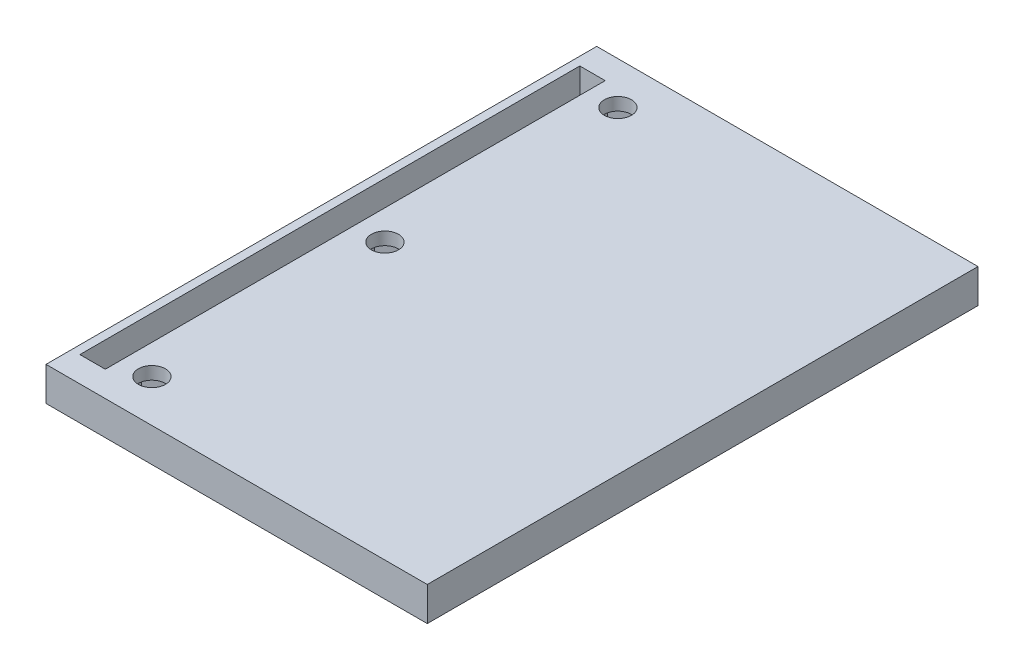
ISO-10303-21;
HEADER;
FILE_DESCRIPTION(('STEP AP214'),'2;1');
FILE_NAME('part.step','',(''),(''),'','','');
FILE_SCHEMA(('AUTOMOTIVE_DESIGN { 1 0 10303 214 1 1 1 1 }'));
ENDSEC;
DATA;
#1=APPLICATION_CONTEXT('core data for automotive mechanical design processes');
#2=APPLICATION_PROTOCOL_DEFINITION('international standard','automotive_design',2000,#1);
#3=PRODUCT_CONTEXT('',#1,'mechanical');
#4=PRODUCT('Part','Part','',(#3));
#5=PRODUCT_RELATED_PRODUCT_CATEGORY('part','',(#4));
#6=PRODUCT_DEFINITION_FORMATION('','',#4);
#7=PRODUCT_DEFINITION_CONTEXT('part definition',#1,'design');
#8=PRODUCT_DEFINITION('design','',#6,#7);
#9=PRODUCT_DEFINITION_SHAPE('','',#8);
#10=(LENGTH_UNIT() NAMED_UNIT(*) SI_UNIT(.MILLI.,.METRE.));
#11=(NAMED_UNIT(*) PLANE_ANGLE_UNIT() SI_UNIT($,.RADIAN.));
#12=(NAMED_UNIT(*) SI_UNIT($,.STERADIAN.) SOLID_ANGLE_UNIT());
#13=UNCERTAINTY_MEASURE_WITH_UNIT(LENGTH_MEASURE(1.E-05),#10,'distance_accuracy_value','');
#14=(GEOMETRIC_REPRESENTATION_CONTEXT(3) GLOBAL_UNCERTAINTY_ASSIGNED_CONTEXT((#13)) GLOBAL_UNIT_ASSIGNED_CONTEXT((#10,
#11,#12)) REPRESENTATION_CONTEXT('',''));
#15=CARTESIAN_POINT('',(0.,0.,0.));
#16=DIRECTION('',(0.,0.,1.));
#17=DIRECTION('',(1.,0.,0.));
#18=AXIS2_PLACEMENT_3D('',#15,#16,#17);
#19=CARTESIAN_POINT('',(-15.,2.,0.));
#20=DIRECTION('',(0.,-1.,0.));
#21=DIRECTION('',(0.,0.,-1.));
#22=AXIS2_PLACEMENT_3D('',#19,#20,#21);
#23=CYLINDRICAL_SURFACE('',#22,1.6);
#24=CARTESIAN_POINT('',(-15.,2.,0.));
#25=DIRECTION('',(0.,1.,0.));
#26=DIRECTION('',(0.,0.,1.));
#27=AXIS2_PLACEMENT_3D('',#24,#25,#26);
#28=CIRCLE('',#27,1.6);
#29=CARTESIAN_POINT('',(-15.,2.,1.60000000000001));
#30=VERTEX_POINT('',#29);
#31=EDGE_CURVE('E390',#30,#30,#28,.T.);
#32=ORIENTED_EDGE('',*,*,#31,.T.);
#33=EDGE_LOOP('',(#32));
#34=FACE_BOUND('',#33,.T.);
#35=CARTESIAN_POINT('',(-15.,0.5,0.));
#36=DIRECTION('',(0.,-1.,0.));
#37=DIRECTION('',(0.,0.,-1.));
#38=AXIS2_PLACEMENT_3D('',#35,#36,#37);
#39=CIRCLE('',#38,1.6);
#40=CARTESIAN_POINT('',(-15.,0.5,-1.59999999999999));
#41=VERTEX_POINT('',#40);
#42=EDGE_CURVE('E423',#41,#41,#39,.T.);
#43=ORIENTED_EDGE('',*,*,#42,.T.);
#44=EDGE_LOOP('',(#43));
#45=FACE_BOUND('',#44,.T.);
#46=ADVANCED_FACE('F32',(#34,#45),#23,.F.);
#47=CARTESIAN_POINT('',(-15.,2.,27.5));
#48=DIRECTION('',(0.,-1.,0.));
#49=DIRECTION('',(0.,0.,-1.));
#50=AXIS2_PLACEMENT_3D('',#47,#48,#49);
#51=CYLINDRICAL_SURFACE('',#50,1.6);
#52=CARTESIAN_POINT('',(-15.,2.,27.5));
#53=DIRECTION('',(0.,1.,0.));
#54=DIRECTION('',(0.,0.,-1.));
#55=AXIS2_PLACEMENT_3D('',#52,#53,#54);
#56=CIRCLE('',#55,1.6);
#57=CARTESIAN_POINT('',(-15.,2.,25.9));
#58=VERTEX_POINT('',#57);
#59=EDGE_CURVE('E387',#58,#58,#56,.T.);
#60=ORIENTED_EDGE('',*,*,#59,.T.);
#61=EDGE_LOOP('',(#60));
#62=FACE_BOUND('',#61,.T.);
#63=CARTESIAN_POINT('',(-15.,0.5,27.5));
#64=DIRECTION('',(0.,-1.,0.));
#65=DIRECTION('',(0.,0.,-1.));
#66=AXIS2_PLACEMENT_3D('',#63,#64,#65);
#67=CIRCLE('',#66,1.6);
#68=CARTESIAN_POINT('',(-15.,0.5,25.9));
#69=VERTEX_POINT('',#68);
#70=EDGE_CURVE('E345',#69,#69,#67,.T.);
#71=ORIENTED_EDGE('',*,*,#70,.T.);
#72=EDGE_LOOP('',(#71));
#73=FACE_BOUND('',#72,.T.);
#74=ADVANCED_FACE('F443',(#62,#73),#51,.F.);
#75=CARTESIAN_POINT('',(0.,2.,0.));
#76=DIRECTION('',(0.,1.,0.));
#77=DIRECTION('',(0.,0.,1.));
#78=AXIS2_PLACEMENT_3D('',#75,#76,#77);
#79=PLANE('',#78);
#80=ORIENTED_EDGE('',*,*,#31,.F.);
#81=EDGE_LOOP('',(#80));
#82=FACE_BOUND('',#81,.T.);
#83=DIRECTION('',(0.,0.,-1.));
#84=VECTOR('',#83,1.);
#85=CARTESIAN_POINT('',(22.5,2.,-32.5));
#86=LINE('',#85,#84);
#87=CARTESIAN_POINT('',(22.5,2.,32.5));
#88=VERTEX_POINT('',#87);
#89=CARTESIAN_POINT('',(22.5,2.,-32.5));
#90=VERTEX_POINT('',#89);
#91=EDGE_CURVE('E397',#88,#90,#86,.T.);
#92=ORIENTED_EDGE('',*,*,#91,.T.);
#93=DIRECTION('',(-1.,0.,0.));
#94=VECTOR('',#93,1.);
#95=CARTESIAN_POINT('',(-22.5,2.,-32.5));
#96=LINE('',#95,#94);
#97=CARTESIAN_POINT('',(-22.5,2.,-32.5));
#98=VERTEX_POINT('',#97);
#99=EDGE_CURVE('E400',#90,#98,#96,.T.);
#100=ORIENTED_EDGE('',*,*,#99,.T.);
#101=DIRECTION('',(0.,0.,1.));
#102=VECTOR('',#101,1.);
#103=CARTESIAN_POINT('',(-22.5,2.,-32.5));
#104=LINE('',#103,#102);
#105=CARTESIAN_POINT('',(-22.5,2.,32.5));
#106=VERTEX_POINT('',#105);
#107=EDGE_CURVE('E403',#98,#106,#104,.T.);
#108=ORIENTED_EDGE('',*,*,#107,.T.);
#109=DIRECTION('',(1.,0.,0.));
#110=VECTOR('',#109,1.);
#111=CARTESIAN_POINT('',(-22.5,2.,32.5));
#112=LINE('',#111,#110);
#113=EDGE_CURVE('E405',#106,#88,#112,.T.);
#114=ORIENTED_EDGE('',*,*,#113,.T.);
#115=EDGE_LOOP('',(#92,#100,#108,#114));
#116=FACE_BOUND('',#115,.T.);
#117=CARTESIAN_POINT('',(-15.,2.,-27.5));
#118=DIRECTION('',(0.,1.,0.));
#119=DIRECTION('',(0.,0.,1.));
#120=AXIS2_PLACEMENT_3D('',#117,#118,#119);
#121=CIRCLE('',#120,1.6);
#122=CARTESIAN_POINT('',(-15.,2.,-25.9));
#123=VERTEX_POINT('',#122);
#124=EDGE_CURVE('E393',#123,#123,#121,.T.);
#125=ORIENTED_EDGE('',*,*,#124,.F.);
#126=EDGE_LOOP('',(#125));
#127=FACE_BOUND('',#126,.T.);
#128=ORIENTED_EDGE('',*,*,#59,.F.);
#129=EDGE_LOOP('',(#128));
#130=FACE_BOUND('',#129,.T.);
#131=DIRECTION('',(-1.,0.,0.));
#132=VECTOR('',#131,1.);
#133=CARTESIAN_POINT('',(-21.5,2.,-29.5));
#134=LINE('',#133,#132);
#135=CARTESIAN_POINT('',(-18.5,2.,-29.5));
#136=VERTEX_POINT('',#135);
#137=CARTESIAN_POINT('',(-21.5,2.,-29.5));
#138=VERTEX_POINT('',#137);
#139=EDGE_CURVE('E358',#136,#138,#134,.T.);
#140=ORIENTED_EDGE('',*,*,#139,.F.);
#141=DIRECTION('',(0.,0.,-1.));
#142=VECTOR('',#141,1.);
#143=CARTESIAN_POINT('',(-18.5,2.,-29.5));
#144=LINE('',#143,#142);
#145=CARTESIAN_POINT('',(-18.5,2.,29.5));
#146=VERTEX_POINT('',#145);
#147=EDGE_CURVE('E356',#146,#136,#144,.T.);
#148=ORIENTED_EDGE('',*,*,#147,.F.);
#149=DIRECTION('',(1.,0.,0.));
#150=VECTOR('',#149,1.);
#151=CARTESIAN_POINT('',(-21.5,2.,29.5));
#152=LINE('',#151,#150);
#153=CARTESIAN_POINT('',(-21.5,2.,29.5));
#154=VERTEX_POINT('',#153);
#155=EDGE_CURVE('E364',#154,#146,#152,.T.);
#156=ORIENTED_EDGE('',*,*,#155,.F.);
#157=DIRECTION('',(0.,0.,1.));
#158=VECTOR('',#157,1.);
#159=CARTESIAN_POINT('',(-21.5,2.,-29.5));
#160=LINE('',#159,#158);
#161=EDGE_CURVE('E361',#138,#154,#160,.T.);
#162=ORIENTED_EDGE('',*,*,#161,.F.);
#163=EDGE_LOOP('',(#140,#148,#156,#162));
#164=FACE_BOUND('',#163,.T.);
#165=ADVANCED_FACE('F439',(#82,#116,#127,#130,#164),#79,.T.);
#166=CARTESIAN_POINT('',(0.,-2.,0.));
#167=DIRECTION('',(0.,1.,0.));
#168=DIRECTION('',(0.,0.,1.));
#169=AXIS2_PLACEMENT_3D('',#166,#167,#168);
#170=PLANE('',#169);
#171=DIRECTION('',(0.866025403784438,0.,0.500000000000001));
#172=VECTOR('',#171,1.);
#173=CARTESIAN_POINT('',(-15.,-2.,24.1802359521597));
#174=LINE('',#173,#172);
#175=CARTESIAN_POINT('',(-15.,-2.,24.1802359521597));
#176=VERTEX_POINT('',#175);
#177=CARTESIAN_POINT('',(-12.125,-2.,25.8401179760799));
#178=VERTEX_POINT('',#177);
#179=EDGE_CURVE('E284',#176,#178,#174,.T.);
#180=ORIENTED_EDGE('',*,*,#179,.F.);
#181=DIRECTION('',(0.866025403784439,0.,-0.5));
#182=VECTOR('',#181,1.);
#183=CARTESIAN_POINT('',(-17.875,-2.,25.8401179760798));
#184=LINE('',#183,#182);
#185=CARTESIAN_POINT('',(-17.875,-2.,25.8401179760798));
#186=VERTEX_POINT('',#185);
#187=EDGE_CURVE('E49',#186,#176,#184,.T.);
#188=ORIENTED_EDGE('',*,*,#187,.F.);
#189=DIRECTION('',(0.,0.,-1.));
#190=VECTOR('',#189,1.);
#191=CARTESIAN_POINT('',(-17.875,-2.,29.1598820239202));
#192=LINE('',#191,#190);
#193=CARTESIAN_POINT('',(-17.875,-2.,29.1598820239202));
#194=VERTEX_POINT('',#193);
#195=EDGE_CURVE('E267',#194,#186,#192,.T.);
#196=ORIENTED_EDGE('',*,*,#195,.F.);
#197=DIRECTION('',(-0.866025403784439,0.,-0.5));
#198=VECTOR('',#197,1.);
#199=CARTESIAN_POINT('',(-15.,-2.,30.8197640478403));
#200=LINE('',#199,#198);
#201=CARTESIAN_POINT('',(-15.,-2.,30.8197640478403));
#202=VERTEX_POINT('',#201);
#203=EDGE_CURVE('E293',#202,#194,#200,.T.);
#204=ORIENTED_EDGE('',*,*,#203,.F.);
#205=DIRECTION('',(-0.866025403784439,0.,0.5));
#206=VECTOR('',#205,1.);
#207=CARTESIAN_POINT('',(-12.125,-2.,29.1598820239202));
#208=LINE('',#207,#206);
#209=CARTESIAN_POINT('',(-12.125,-2.,29.1598820239202));
#210=VERTEX_POINT('',#209);
#211=EDGE_CURVE('E290',#210,#202,#208,.T.);
#212=ORIENTED_EDGE('',*,*,#211,.F.);
#213=DIRECTION('',(0.,0.,1.));
#214=VECTOR('',#213,1.);
#215=CARTESIAN_POINT('',(-12.125,-2.,25.8401179760799));
#216=LINE('',#215,#214);
#217=EDGE_CURVE('E287',#178,#210,#216,.T.);
#218=ORIENTED_EDGE('',*,*,#217,.F.);
#219=EDGE_LOOP('',(#180,#188,#196,#204,#212,#218));
#220=FACE_BOUND('',#219,.T.);
#221=DIRECTION('',(0.866025403784439,0.,-0.5));
#222=VECTOR('',#221,1.);
#223=CARTESIAN_POINT('',(-15.,-2.,-30.8197640478404));
#224=LINE('',#223,#222);
#225=CARTESIAN_POINT('',(-17.875,-2.,-29.1598820239202));
#226=VERTEX_POINT('',#225);
#227=CARTESIAN_POINT('',(-15.,-2.,-30.8197640478404));
#228=VERTEX_POINT('',#227);
#229=EDGE_CURVE('E242',#226,#228,#224,.T.);
#230=ORIENTED_EDGE('',*,*,#229,.F.);
#231=DIRECTION('',(0.,0.,-1.));
#232=VECTOR('',#231,1.);
#233=CARTESIAN_POINT('',(-17.875,-2.,-29.1598820239202));
#234=LINE('',#233,#232);
#235=CARTESIAN_POINT('',(-17.875,-2.,-25.8401179760798));
#236=VERTEX_POINT('',#235);
#237=EDGE_CURVE('E57',#236,#226,#234,.T.);
#238=ORIENTED_EDGE('',*,*,#237,.F.);
#239=DIRECTION('',(-0.866025403784438,0.,-0.5));
#240=VECTOR('',#239,1.);
#241=CARTESIAN_POINT('',(-17.875,-2.,-25.8401179760798));
#242=LINE('',#241,#240);
#243=CARTESIAN_POINT('',(-15.,-2.,-24.1802359521597));
#244=VERTEX_POINT('',#243);
#245=EDGE_CURVE('E228',#244,#236,#242,.T.);
#246=ORIENTED_EDGE('',*,*,#245,.F.);
#247=DIRECTION('',(-0.866025403784439,0.,0.499999999999999));
#248=VECTOR('',#247,1.);
#249=CARTESIAN_POINT('',(-15.,-2.,-24.1802359521597));
#250=LINE('',#249,#248);
#251=CARTESIAN_POINT('',(-12.125,-2.,-25.8401179760799));
#252=VERTEX_POINT('',#251);
#253=EDGE_CURVE('E231',#252,#244,#250,.T.);
#254=ORIENTED_EDGE('',*,*,#253,.F.);
#255=DIRECTION('',(0.,0.,1.));
#256=VECTOR('',#255,1.);
#257=CARTESIAN_POINT('',(-12.125,-2.,-25.8401179760799));
#258=LINE('',#257,#256);
#259=CARTESIAN_POINT('',(-12.125,-2.,-29.1598820239202));
#260=VERTEX_POINT('',#259);
#261=EDGE_CURVE('E248',#260,#252,#258,.T.);
#262=ORIENTED_EDGE('',*,*,#261,.F.);
#263=DIRECTION('',(0.866025403784438,0.,0.500000000000001));
#264=VECTOR('',#263,1.);
#265=CARTESIAN_POINT('',(-12.125,-2.,-29.1598820239202));
#266=LINE('',#265,#264);
#267=EDGE_CURVE('E245',#228,#260,#266,.T.);
#268=ORIENTED_EDGE('',*,*,#267,.F.);
#269=EDGE_LOOP('',(#230,#238,#246,#254,#262,#268));
#270=FACE_BOUND('',#269,.T.);
#271=DIRECTION('',(0.866025403784439,0.,0.5));
#272=VECTOR('',#271,1.);
#273=CARTESIAN_POINT('',(-15.,-2.,-3.31976404784034));
#274=LINE('',#273,#272);
#275=CARTESIAN_POINT('',(-15.,-2.,-3.31976404784034));
#276=VERTEX_POINT('',#275);
#277=CARTESIAN_POINT('',(-12.125,-2.,-1.65988202392016));
#278=VERTEX_POINT('',#277);
#279=EDGE_CURVE('E329',#276,#278,#274,.T.);
#280=ORIENTED_EDGE('',*,*,#279,.F.);
#281=DIRECTION('',(0.866025403784438,0.,-0.5));
#282=VECTOR('',#281,1.);
#283=CARTESIAN_POINT('',(-17.875,-2.,-1.65988202392017));
#284=LINE('',#283,#282);
#285=CARTESIAN_POINT('',(-17.875,-2.,-1.65988202392017));
#286=VERTEX_POINT('',#285);
#287=EDGE_CURVE('E255',#286,#276,#284,.T.);
#288=ORIENTED_EDGE('',*,*,#287,.F.);
#289=DIRECTION('',(0.,0.,-1.));
#290=VECTOR('',#289,1.);
#291=CARTESIAN_POINT('',(-17.875,-2.,1.65988202392018));
#292=LINE('',#291,#290);
#293=CARTESIAN_POINT('',(-17.875,-2.,1.65988202392018));
#294=VERTEX_POINT('',#293);
#295=EDGE_CURVE('E312',#294,#286,#292,.T.);
#296=ORIENTED_EDGE('',*,*,#295,.F.);
#297=DIRECTION('',(-0.866025403784439,0.,-0.5));
#298=VECTOR('',#297,1.);
#299=CARTESIAN_POINT('',(-15.,-2.,3.31976404784036));
#300=LINE('',#299,#298);
#301=CARTESIAN_POINT('',(-15.,-2.,3.31976404784036));
#302=VERTEX_POINT('',#301);
#303=EDGE_CURVE('E338',#302,#294,#300,.T.);
#304=ORIENTED_EDGE('',*,*,#303,.F.);
#305=DIRECTION('',(-0.866025403784439,0.,0.5));
#306=VECTOR('',#305,1.);
#307=CARTESIAN_POINT('',(-12.125,-2.,1.65988202392018));
#308=LINE('',#307,#306);
#309=CARTESIAN_POINT('',(-12.125,-2.,1.65988202392018));
#310=VERTEX_POINT('',#309);
#311=EDGE_CURVE('E335',#310,#302,#308,.T.);
#312=ORIENTED_EDGE('',*,*,#311,.F.);
#313=DIRECTION('',(0.,0.,1.));
#314=VECTOR('',#313,1.);
#315=CARTESIAN_POINT('',(-12.125,-2.,-1.65988202392016));
#316=LINE('',#315,#314);
#317=EDGE_CURVE('E332',#278,#310,#316,.T.);
#318=ORIENTED_EDGE('',*,*,#317,.F.);
#319=EDGE_LOOP('',(#280,#288,#296,#304,#312,#318));
#320=FACE_BOUND('',#319,.T.);
#321=DIRECTION('',(0.,0.,-1.));
#322=VECTOR('',#321,1.);
#323=CARTESIAN_POINT('',(22.5,-2.,-32.5));
#324=LINE('',#323,#322);
#325=CARTESIAN_POINT('',(22.5,-2.,32.5));
#326=VERTEX_POINT('',#325);
#327=CARTESIAN_POINT('',(22.5,-2.,-32.5));
#328=VERTEX_POINT('',#327);
#329=EDGE_CURVE('E396',#326,#328,#324,.T.);
#330=ORIENTED_EDGE('',*,*,#329,.F.);
#331=DIRECTION('',(1.,0.,0.));
#332=VECTOR('',#331,1.);
#333=CARTESIAN_POINT('',(-22.5,-2.,32.5));
#334=LINE('',#333,#332);
#335=CARTESIAN_POINT('',(-22.5,-2.,32.5));
#336=VERTEX_POINT('',#335);
#337=EDGE_CURVE('E401',#336,#326,#334,.T.);
#338=ORIENTED_EDGE('',*,*,#337,.F.);
#339=DIRECTION('',(0.,0.,1.));
#340=VECTOR('',#339,1.);
#341=CARTESIAN_POINT('',(-22.5,-2.,-32.5));
#342=LINE('',#341,#340);
#343=CARTESIAN_POINT('',(-22.5,-2.,-32.5));
#344=VERTEX_POINT('',#343);
#345=EDGE_CURVE('E412',#344,#336,#342,.T.);
#346=ORIENTED_EDGE('',*,*,#345,.F.);
#347=DIRECTION('',(-1.,0.,0.));
#348=VECTOR('',#347,1.);
#349=CARTESIAN_POINT('',(-22.5,-2.,-32.5));
#350=LINE('',#349,#348);
#351=EDGE_CURVE('E410',#328,#344,#350,.T.);
#352=ORIENTED_EDGE('',*,*,#351,.F.);
#353=EDGE_LOOP('',(#330,#338,#346,#352));
#354=FACE_BOUND('',#353,.T.);
#355=DIRECTION('',(0.,0.,-1.));
#356=VECTOR('',#355,1.);
#357=CARTESIAN_POINT('',(-18.5,-2.,-29.5));
#358=LINE('',#357,#356);
#359=CARTESIAN_POINT('',(-18.5,-2.,29.5));
#360=VERTEX_POINT('',#359);
#361=CARTESIAN_POINT('',(-18.5,-2.,-29.5));
#362=VERTEX_POINT('',#361);
#363=EDGE_CURVE('E367',#360,#362,#358,.T.);
#364=ORIENTED_EDGE('',*,*,#363,.T.);
#365=DIRECTION('',(-1.,0.,0.));
#366=VECTOR('',#365,1.);
#367=CARTESIAN_POINT('',(-21.5,-2.,-29.5));
#368=LINE('',#367,#366);
#369=CARTESIAN_POINT('',(-21.5,-2.,-29.5));
#370=VERTEX_POINT('',#369);
#371=EDGE_CURVE('E370',#362,#370,#368,.T.);
#372=ORIENTED_EDGE('',*,*,#371,.T.);
#373=DIRECTION('',(0.,0.,1.));
#374=VECTOR('',#373,1.);
#375=CARTESIAN_POINT('',(-21.5,-2.,-29.5));
#376=LINE('',#375,#374);
#377=CARTESIAN_POINT('',(-21.5,-2.,29.5));
#378=VERTEX_POINT('',#377);
#379=EDGE_CURVE('E373',#370,#378,#376,.T.);
#380=ORIENTED_EDGE('',*,*,#379,.T.);
#381=DIRECTION('',(1.,0.,0.));
#382=VECTOR('',#381,1.);
#383=CARTESIAN_POINT('',(-21.5,-2.,29.5));
#384=LINE('',#383,#382);
#385=EDGE_CURVE('E359',#378,#360,#384,.T.);
#386=ORIENTED_EDGE('',*,*,#385,.T.);
#387=EDGE_LOOP('',(#364,#372,#380,#386));
#388=FACE_BOUND('',#387,.T.);
#389=ADVANCED_FACE('F442',(#220,#270,#320,#354,#388),#170,.F.);
#390=CARTESIAN_POINT('',(22.5,2.,-32.5));
#391=DIRECTION('',(-1.,0.,0.));
#392=DIRECTION('',(0.,0.,1.));
#393=AXIS2_PLACEMENT_3D('',#390,#391,#392);
#394=PLANE('',#393);
#395=ORIENTED_EDGE('',*,*,#329,.T.);
#396=DIRECTION('',(0.,-1.,0.));
#397=VECTOR('',#396,1.);
#398=CARTESIAN_POINT('',(22.5,2.,-32.5));
#399=LINE('',#398,#397);
#400=EDGE_CURVE('E11',#90,#328,#399,.T.);
#401=ORIENTED_EDGE('',*,*,#400,.F.);
#402=ORIENTED_EDGE('',*,*,#91,.F.);
#403=DIRECTION('',(0.,-1.,0.));
#404=VECTOR('',#403,1.);
#405=CARTESIAN_POINT('',(22.5,2.,32.5));
#406=LINE('',#405,#404);
#407=EDGE_CURVE('E407',#88,#326,#406,.T.);
#408=ORIENTED_EDGE('',*,*,#407,.T.);
#409=EDGE_LOOP('',(#395,#401,#402,#408));
#410=FACE_BOUND('',#409,.T.);
#411=ADVANCED_FACE('F34',(#410),#394,.F.);
#412=CARTESIAN_POINT('',(-22.5,2.,-32.5));
#413=DIRECTION('',(0.,0.,1.));
#414=DIRECTION('',(1.,0.,0.));
#415=AXIS2_PLACEMENT_3D('',#412,#413,#414);
#416=PLANE('',#415);
#417=ORIENTED_EDGE('',*,*,#351,.T.);
#418=DIRECTION('',(0.,-1.,0.));
#419=VECTOR('',#418,1.);
#420=CARTESIAN_POINT('',(-22.5,2.,-32.5));
#421=LINE('',#420,#419);
#422=EDGE_CURVE('E41',#98,#344,#421,.T.);
#423=ORIENTED_EDGE('',*,*,#422,.F.);
#424=ORIENTED_EDGE('',*,*,#99,.F.);
#425=ORIENTED_EDGE('',*,*,#400,.T.);
#426=EDGE_LOOP('',(#417,#423,#424,#425));
#427=FACE_BOUND('',#426,.T.);
#428=ADVANCED_FACE('F494',(#427),#416,.F.);
#429=CARTESIAN_POINT('',(-22.5,2.,-32.5));
#430=DIRECTION('',(1.,0.,0.));
#431=DIRECTION('',(0.,0.,-1.));
#432=AXIS2_PLACEMENT_3D('',#429,#430,#431);
#433=PLANE('',#432);
#434=ORIENTED_EDGE('',*,*,#345,.T.);
#435=DIRECTION('',(0.,-1.,0.));
#436=VECTOR('',#435,1.);
#437=CARTESIAN_POINT('',(-22.5,2.,32.5));
#438=LINE('',#437,#436);
#439=EDGE_CURVE('E417',#106,#336,#438,.T.);
#440=ORIENTED_EDGE('',*,*,#439,.F.);
#441=ORIENTED_EDGE('',*,*,#107,.F.);
#442=ORIENTED_EDGE('',*,*,#422,.T.);
#443=EDGE_LOOP('',(#434,#440,#441,#442));
#444=FACE_BOUND('',#443,.T.);
#445=ADVANCED_FACE('F491',(#444),#433,.F.);
#446=CARTESIAN_POINT('',(-22.5,2.,32.5));
#447=DIRECTION('',(0.,0.,-1.));
#448=DIRECTION('',(-1.,0.,0.));
#449=AXIS2_PLACEMENT_3D('',#446,#447,#448);
#450=PLANE('',#449);
#451=ORIENTED_EDGE('',*,*,#337,.T.);
#452=ORIENTED_EDGE('',*,*,#407,.F.);
#453=ORIENTED_EDGE('',*,*,#113,.F.);
#454=ORIENTED_EDGE('',*,*,#439,.T.);
#455=EDGE_LOOP('',(#451,#452,#453,#454));
#456=FACE_BOUND('',#455,.T.);
#457=ADVANCED_FACE('F435',(#456),#450,.F.);
#458=CARTESIAN_POINT('',(-15.,2.,-27.5));
#459=DIRECTION('',(0.,-1.,0.));
#460=DIRECTION('',(0.,0.,-1.));
#461=AXIS2_PLACEMENT_3D('',#458,#459,#460);
#462=CYLINDRICAL_SURFACE('',#461,1.6);
#463=CARTESIAN_POINT('',(-15.,0.5,-27.5));
#464=DIRECTION('',(0.,1.,0.));
#465=DIRECTION('',(0.,0.,1.));
#466=AXIS2_PLACEMENT_3D('',#463,#464,#465);
#467=CIRCLE('',#466,1.6);
#468=CARTESIAN_POINT('',(-15.,0.5,-25.9));
#469=VERTEX_POINT('',#468);
#470=EDGE_CURVE('E36',#469,#469,#467,.T.);
#471=ORIENTED_EDGE('',*,*,#470,.F.);
#472=EDGE_LOOP('',(#471));
#473=FACE_BOUND('',#472,.T.);
#474=ORIENTED_EDGE('',*,*,#124,.T.);
#475=EDGE_LOOP('',(#474));
#476=FACE_BOUND('',#475,.T.);
#477=ADVANCED_FACE('F431',(#473,#476),#462,.F.);
#478=CARTESIAN_POINT('',(-18.5,2.,-29.5));
#479=DIRECTION('',(-1.,0.,0.));
#480=DIRECTION('',(0.,0.,1.));
#481=AXIS2_PLACEMENT_3D('',#478,#479,#480);
#482=PLANE('',#481);
#483=ORIENTED_EDGE('',*,*,#363,.F.);
#484=DIRECTION('',(0.,-1.,0.));
#485=VECTOR('',#484,1.);
#486=CARTESIAN_POINT('',(-18.5,2.,29.5));
#487=LINE('',#486,#485);
#488=EDGE_CURVE('E366',#146,#360,#487,.T.);
#489=ORIENTED_EDGE('',*,*,#488,.F.);
#490=ORIENTED_EDGE('',*,*,#147,.T.);
#491=DIRECTION('',(0.,-1.,0.));
#492=VECTOR('',#491,1.);
#493=CARTESIAN_POINT('',(-18.5,2.,-29.5));
#494=LINE('',#493,#492);
#495=EDGE_CURVE('E384',#136,#362,#494,.T.);
#496=ORIENTED_EDGE('',*,*,#495,.T.);
#497=EDGE_LOOP('',(#483,#489,#490,#496));
#498=FACE_BOUND('',#497,.T.);
#499=ADVANCED_FACE('F434',(#498),#482,.T.);
#500=CARTESIAN_POINT('',(-21.5,2.,-29.5));
#501=DIRECTION('',(0.,0.,1.));
#502=DIRECTION('',(1.,0.,0.));
#503=AXIS2_PLACEMENT_3D('',#500,#501,#502);
#504=PLANE('',#503);
#505=ORIENTED_EDGE('',*,*,#371,.F.);
#506=ORIENTED_EDGE('',*,*,#495,.F.);
#507=ORIENTED_EDGE('',*,*,#139,.T.);
#508=DIRECTION('',(0.,-1.,0.));
#509=VECTOR('',#508,1.);
#510=CARTESIAN_POINT('',(-21.5,2.,-29.5));
#511=LINE('',#510,#509);
#512=EDGE_CURVE('E382',#138,#370,#511,.T.);
#513=ORIENTED_EDGE('',*,*,#512,.T.);
#514=EDGE_LOOP('',(#505,#506,#507,#513));
#515=FACE_BOUND('',#514,.T.);
#516=ADVANCED_FACE('F455',(#515),#504,.T.);
#517=CARTESIAN_POINT('',(-21.5,2.,-29.5));
#518=DIRECTION('',(1.,0.,0.));
#519=DIRECTION('',(0.,0.,-1.));
#520=AXIS2_PLACEMENT_3D('',#517,#518,#519);
#521=PLANE('',#520);
#522=ORIENTED_EDGE('',*,*,#379,.F.);
#523=ORIENTED_EDGE('',*,*,#512,.F.);
#524=ORIENTED_EDGE('',*,*,#161,.T.);
#525=DIRECTION('',(0.,-1.,0.));
#526=VECTOR('',#525,1.);
#527=CARTESIAN_POINT('',(-21.5,2.,29.5));
#528=LINE('',#527,#526);
#529=EDGE_CURVE('E380',#154,#378,#528,.T.);
#530=ORIENTED_EDGE('',*,*,#529,.T.);
#531=EDGE_LOOP('',(#522,#523,#524,#530));
#532=FACE_BOUND('',#531,.T.);
#533=ADVANCED_FACE('F458',(#532),#521,.T.);
#534=CARTESIAN_POINT('',(-21.5,2.,29.5));
#535=DIRECTION('',(0.,0.,-1.));
#536=DIRECTION('',(-1.,0.,0.));
#537=AXIS2_PLACEMENT_3D('',#534,#535,#536);
#538=PLANE('',#537);
#539=ORIENTED_EDGE('',*,*,#385,.F.);
#540=ORIENTED_EDGE('',*,*,#529,.F.);
#541=ORIENTED_EDGE('',*,*,#155,.T.);
#542=ORIENTED_EDGE('',*,*,#488,.T.);
#543=EDGE_LOOP('',(#539,#540,#541,#542));
#544=FACE_BOUND('',#543,.T.);
#545=ADVANCED_FACE('F464',(#544),#538,.T.);
#546=CARTESIAN_POINT('',(-17.875,0.5,25.8401179760798));
#547=DIRECTION('',(-0.5,0.,-0.866025403784439));
#548=DIRECTION('',(-0.866025403784439,0.,0.5));
#549=AXIS2_PLACEMENT_3D('',#546,#547,#548);
#550=PLANE('',#549);
#551=ORIENTED_EDGE('',*,*,#187,.T.);
#552=DIRECTION('',(0.,-1.,0.));
#553=VECTOR('',#552,1.);
#554=CARTESIAN_POINT('',(-15.,0.5,24.1802359521597));
#555=LINE('',#554,#553);
#556=CARTESIAN_POINT('',(-15.,0.5,24.1802359521597));
#557=VERTEX_POINT('',#556);
#558=EDGE_CURVE('E282',#557,#176,#555,.T.);
#559=ORIENTED_EDGE('',*,*,#558,.F.);
#560=DIRECTION('',(0.866025403784439,0.,-0.5));
#561=VECTOR('',#560,1.);
#562=CARTESIAN_POINT('',(-17.875,0.5,25.8401179760798));
#563=LINE('',#562,#561);
#564=CARTESIAN_POINT('',(-17.875,0.5,25.8401179760798));
#565=VERTEX_POINT('',#564);
#566=EDGE_CURVE('E263',#565,#557,#563,.T.);
#567=ORIENTED_EDGE('',*,*,#566,.F.);
#568=DIRECTION('',(0.,-1.,0.));
#569=VECTOR('',#568,1.);
#570=CARTESIAN_POINT('',(-17.875,0.5,25.8401179760798));
#571=LINE('',#570,#569);
#572=EDGE_CURVE('E243',#565,#186,#571,.T.);
#573=ORIENTED_EDGE('',*,*,#572,.T.);
#574=EDGE_LOOP('',(#551,#559,#567,#573));
#575=FACE_BOUND('',#574,.T.);
#576=ADVANCED_FACE('F466',(#575),#550,.F.);
#577=CARTESIAN_POINT('',(-17.875,0.5,29.1598820239202));
#578=DIRECTION('',(-1.,0.,0.));
#579=DIRECTION('',(0.,0.,1.));
#580=AXIS2_PLACEMENT_3D('',#577,#578,#579);
#581=PLANE('',#580);
#582=ORIENTED_EDGE('',*,*,#195,.T.);
#583=ORIENTED_EDGE('',*,*,#572,.F.);
#584=DIRECTION('',(0.,0.,-1.));
#585=VECTOR('',#584,1.);
#586=CARTESIAN_POINT('',(-17.875,0.5,29.1598820239202));
#587=LINE('',#586,#585);
#588=CARTESIAN_POINT('',(-17.875,0.5,29.1598820239202));
#589=VERTEX_POINT('',#588);
#590=EDGE_CURVE('E279',#589,#565,#587,.T.);
#591=ORIENTED_EDGE('',*,*,#590,.F.);
#592=DIRECTION('',(0.,-1.,0.));
#593=VECTOR('',#592,1.);
#594=CARTESIAN_POINT('',(-17.875,0.5,29.1598820239202));
#595=LINE('',#594,#593);
#596=EDGE_CURVE('E299',#589,#194,#595,.T.);
#597=ORIENTED_EDGE('',*,*,#596,.T.);
#598=EDGE_LOOP('',(#582,#583,#591,#597));
#599=FACE_BOUND('',#598,.T.);
#600=ADVANCED_FACE('F472',(#599),#581,.F.);
#601=CARTESIAN_POINT('',(-15.,0.5,30.8197640478403));
#602=DIRECTION('',(-0.5,0.,0.866025403784439));
#603=DIRECTION('',(0.866025403784439,0.,0.5));
#604=AXIS2_PLACEMENT_3D('',#601,#602,#603);
#605=PLANE('',#604);
#606=ORIENTED_EDGE('',*,*,#203,.T.);
#607=ORIENTED_EDGE('',*,*,#596,.F.);
#608=DIRECTION('',(-0.866025403784439,0.,-0.5));
#609=VECTOR('',#608,1.);
#610=CARTESIAN_POINT('',(-15.,0.5,30.8197640478403));
#611=LINE('',#610,#609);
#612=CARTESIAN_POINT('',(-15.,0.5,30.8197640478403));
#613=VERTEX_POINT('',#612);
#614=EDGE_CURVE('E276',#613,#589,#611,.T.);
#615=ORIENTED_EDGE('',*,*,#614,.F.);
#616=DIRECTION('',(0.,-1.,0.));
#617=VECTOR('',#616,1.);
#618=CARTESIAN_POINT('',(-15.,0.5,30.8197640478403));
#619=LINE('',#618,#617);
#620=EDGE_CURVE('E301',#613,#202,#619,.T.);
#621=ORIENTED_EDGE('',*,*,#620,.T.);
#622=EDGE_LOOP('',(#606,#607,#615,#621));
#623=FACE_BOUND('',#622,.T.);
#624=ADVANCED_FACE('F600',(#623),#605,.F.);
#625=CARTESIAN_POINT('',(-12.125,0.5,29.1598820239202));
#626=DIRECTION('',(0.5,0.,0.866025403784439));
#627=DIRECTION('',(0.866025403784439,0.,-0.5));
#628=AXIS2_PLACEMENT_3D('',#625,#626,#627);
#629=PLANE('',#628);
#630=ORIENTED_EDGE('',*,*,#211,.T.);
#631=ORIENTED_EDGE('',*,*,#620,.F.);
#632=DIRECTION('',(-0.866025403784439,0.,0.5));
#633=VECTOR('',#632,1.);
#634=CARTESIAN_POINT('',(-12.125,0.5,29.1598820239202));
#635=LINE('',#634,#633);
#636=CARTESIAN_POINT('',(-12.125,0.5,29.1598820239202));
#637=VERTEX_POINT('',#636);
#638=EDGE_CURVE('E273',#637,#613,#635,.T.);
#639=ORIENTED_EDGE('',*,*,#638,.F.);
#640=DIRECTION('',(0.,-1.,0.));
#641=VECTOR('',#640,1.);
#642=CARTESIAN_POINT('',(-12.125,0.5,29.1598820239202));
#643=LINE('',#642,#641);
#644=EDGE_CURVE('E303',#637,#210,#643,.T.);
#645=ORIENTED_EDGE('',*,*,#644,.T.);
#646=EDGE_LOOP('',(#630,#631,#639,#645));
#647=FACE_BOUND('',#646,.T.);
#648=ADVANCED_FACE('F610',(#647),#629,.F.);
#649=CARTESIAN_POINT('',(-12.125,0.5,25.8401179760799));
#650=DIRECTION('',(1.,0.,0.));
#651=DIRECTION('',(0.,0.,-1.));
#652=AXIS2_PLACEMENT_3D('',#649,#650,#651);
#653=PLANE('',#652);
#654=ORIENTED_EDGE('',*,*,#217,.T.);
#655=ORIENTED_EDGE('',*,*,#644,.F.);
#656=DIRECTION('',(0.,0.,1.));
#657=VECTOR('',#656,1.);
#658=CARTESIAN_POINT('',(-12.125,0.5,25.8401179760799));
#659=LINE('',#658,#657);
#660=CARTESIAN_POINT('',(-12.125,0.5,25.8401179760799));
#661=VERTEX_POINT('',#660);
#662=EDGE_CURVE('E270',#661,#637,#659,.T.);
#663=ORIENTED_EDGE('',*,*,#662,.F.);
#664=DIRECTION('',(0.,-1.,0.));
#665=VECTOR('',#664,1.);
#666=CARTESIAN_POINT('',(-12.125,0.5,25.8401179760799));
#667=LINE('',#666,#665);
#668=EDGE_CURVE('E305',#661,#178,#667,.T.);
#669=ORIENTED_EDGE('',*,*,#668,.T.);
#670=EDGE_LOOP('',(#654,#655,#663,#669));
#671=FACE_BOUND('',#670,.T.);
#672=ADVANCED_FACE('F620',(#671),#653,.F.);
#673=CARTESIAN_POINT('',(-15.,0.5,24.1802359521597));
#674=DIRECTION('',(0.500000000000001,0.,-0.866025403784438));
#675=DIRECTION('',(-0.866025403784438,0.,-0.500000000000001));
#676=AXIS2_PLACEMENT_3D('',#673,#674,#675);
#677=PLANE('',#676);
#678=ORIENTED_EDGE('',*,*,#179,.T.);
#679=ORIENTED_EDGE('',*,*,#668,.F.);
#680=DIRECTION('',(0.866025403784438,0.,0.500000000000001));
#681=VECTOR('',#680,1.);
#682=CARTESIAN_POINT('',(-15.,0.5,24.1802359521597));
#683=LINE('',#682,#681);
#684=EDGE_CURVE('E266',#557,#661,#683,.T.);
#685=ORIENTED_EDGE('',*,*,#684,.F.);
#686=ORIENTED_EDGE('',*,*,#558,.T.);
#687=EDGE_LOOP('',(#678,#679,#685,#686));
#688=FACE_BOUND('',#687,.T.);
#689=ADVANCED_FACE('F630',(#688),#677,.F.);
#690=CARTESIAN_POINT('',(0.,0.5,0.));
#691=DIRECTION('',(0.,-1.,0.));
#692=DIRECTION('',(0.,0.,-1.));
#693=AXIS2_PLACEMENT_3D('',#690,#691,#692);
#694=PLANE('',#693);
#695=ORIENTED_EDGE('',*,*,#70,.F.);
#696=EDGE_LOOP('',(#695));
#697=FACE_BOUND('',#696,.T.);
#698=ORIENTED_EDGE('',*,*,#566,.T.);
#699=ORIENTED_EDGE('',*,*,#684,.T.);
#700=ORIENTED_EDGE('',*,*,#662,.T.);
#701=ORIENTED_EDGE('',*,*,#638,.T.);
#702=ORIENTED_EDGE('',*,*,#614,.T.);
#703=ORIENTED_EDGE('',*,*,#590,.T.);
#704=EDGE_LOOP('',(#698,#699,#700,#701,#702,#703));
#705=FACE_BOUND('',#704,.T.);
#706=ADVANCED_FACE('F640',(#697,#705),#694,.T.);
#707=CARTESIAN_POINT('',(-17.875,0.5,-1.65988202392017));
#708=DIRECTION('',(-0.5,0.,-0.866025403784438));
#709=DIRECTION('',(-0.866025403784439,0.,0.5));
#710=AXIS2_PLACEMENT_3D('',#707,#708,#709);
#711=PLANE('',#710);
#712=ORIENTED_EDGE('',*,*,#287,.T.);
#713=DIRECTION('',(0.,-1.,0.));
#714=VECTOR('',#713,1.);
#715=CARTESIAN_POINT('',(-15.,0.5,-3.31976404784034));
#716=LINE('',#715,#714);
#717=CARTESIAN_POINT('',(-15.,0.5,-3.31976404784034));
#718=VERTEX_POINT('',#717);
#719=EDGE_CURVE('E327',#718,#276,#716,.T.);
#720=ORIENTED_EDGE('',*,*,#719,.F.);
#721=DIRECTION('',(0.866025403784438,0.,-0.5));
#722=VECTOR('',#721,1.);
#723=CARTESIAN_POINT('',(-17.875,0.5,-1.65988202392017));
#724=LINE('',#723,#722);
#725=CARTESIAN_POINT('',(-17.875,0.5,-1.65988202392017));
#726=VERTEX_POINT('',#725);
#727=EDGE_CURVE('E308',#726,#718,#724,.T.);
#728=ORIENTED_EDGE('',*,*,#727,.F.);
#729=DIRECTION('',(0.,-1.,0.));
#730=VECTOR('',#729,1.);
#731=CARTESIAN_POINT('',(-17.875,0.5,-1.65988202392017));
#732=LINE('',#731,#730);
#733=EDGE_CURVE('E343',#726,#286,#732,.T.);
#734=ORIENTED_EDGE('',*,*,#733,.T.);
#735=EDGE_LOOP('',(#712,#720,#728,#734));
#736=FACE_BOUND('',#735,.T.);
#737=ADVANCED_FACE('F650',(#736),#711,.F.);
#738=CARTESIAN_POINT('',(-17.875,0.5,1.65988202392018));
#739=DIRECTION('',(-1.,0.,0.));
#740=DIRECTION('',(0.,0.,1.));
#741=AXIS2_PLACEMENT_3D('',#738,#739,#740);
#742=PLANE('',#741);
#743=ORIENTED_EDGE('',*,*,#295,.T.);
#744=ORIENTED_EDGE('',*,*,#733,.F.);
#745=DIRECTION('',(0.,0.,-1.));
#746=VECTOR('',#745,1.);
#747=CARTESIAN_POINT('',(-17.875,0.5,1.65988202392018));
#748=LINE('',#747,#746);
#749=CARTESIAN_POINT('',(-17.875,0.5,1.65988202392018));
#750=VERTEX_POINT('',#749);
#751=EDGE_CURVE('E324',#750,#726,#748,.T.);
#752=ORIENTED_EDGE('',*,*,#751,.F.);
#753=DIRECTION('',(0.,-1.,0.));
#754=VECTOR('',#753,1.);
#755=CARTESIAN_POINT('',(-17.875,0.5,1.65988202392018));
#756=LINE('',#755,#754);
#757=EDGE_CURVE('E346',#750,#294,#756,.T.);
#758=ORIENTED_EDGE('',*,*,#757,.T.);
#759=EDGE_LOOP('',(#743,#744,#752,#758));
#760=FACE_BOUND('',#759,.T.);
#761=ADVANCED_FACE('F660',(#760),#742,.F.);
#762=CARTESIAN_POINT('',(-15.,0.5,3.31976404784036));
#763=DIRECTION('',(-0.5,0.,0.866025403784439));
#764=DIRECTION('',(0.866025403784439,0.,0.5));
#765=AXIS2_PLACEMENT_3D('',#762,#763,#764);
#766=PLANE('',#765);
#767=ORIENTED_EDGE('',*,*,#303,.T.);
#768=ORIENTED_EDGE('',*,*,#757,.F.);
#769=DIRECTION('',(-0.866025403784439,0.,-0.5));
#770=VECTOR('',#769,1.);
#771=CARTESIAN_POINT('',(-15.,0.5,3.31976404784036));
#772=LINE('',#771,#770);
#773=CARTESIAN_POINT('',(-15.,0.5,3.31976404784036));
#774=VERTEX_POINT('',#773);
#775=EDGE_CURVE('E321',#774,#750,#772,.T.);
#776=ORIENTED_EDGE('',*,*,#775,.F.);
#777=DIRECTION('',(0.,-1.,0.));
#778=VECTOR('',#777,1.);
#779=CARTESIAN_POINT('',(-15.,0.5,3.31976404784036));
#780=LINE('',#779,#778);
#781=EDGE_CURVE('E348',#774,#302,#780,.T.);
#782=ORIENTED_EDGE('',*,*,#781,.T.);
#783=EDGE_LOOP('',(#767,#768,#776,#782));
#784=FACE_BOUND('',#783,.T.);
#785=ADVANCED_FACE('F669',(#784),#766,.F.);
#786=CARTESIAN_POINT('',(-12.125,0.5,1.65988202392018));
#787=DIRECTION('',(0.5,0.,0.866025403784439));
#788=DIRECTION('',(0.866025403784439,0.,-0.5));
#789=AXIS2_PLACEMENT_3D('',#786,#787,#788);
#790=PLANE('',#789);
#791=ORIENTED_EDGE('',*,*,#311,.T.);
#792=ORIENTED_EDGE('',*,*,#781,.F.);
#793=DIRECTION('',(-0.866025403784439,0.,0.5));
#794=VECTOR('',#793,1.);
#795=CARTESIAN_POINT('',(-12.125,0.5,1.65988202392018));
#796=LINE('',#795,#794);
#797=CARTESIAN_POINT('',(-12.125,0.5,1.65988202392018));
#798=VERTEX_POINT('',#797);
#799=EDGE_CURVE('E318',#798,#774,#796,.T.);
#800=ORIENTED_EDGE('',*,*,#799,.F.);
#801=DIRECTION('',(0.,-1.,0.));
#802=VECTOR('',#801,1.);
#803=CARTESIAN_POINT('',(-12.125,0.5,1.65988202392018));
#804=LINE('',#803,#802);
#805=EDGE_CURVE('E350',#798,#310,#804,.T.);
#806=ORIENTED_EDGE('',*,*,#805,.T.);
#807=EDGE_LOOP('',(#791,#792,#800,#806));
#808=FACE_BOUND('',#807,.T.);
#809=ADVANCED_FACE('F679',(#808),#790,.F.);
#810=CARTESIAN_POINT('',(-12.125,0.5,-1.65988202392016));
#811=DIRECTION('',(1.,0.,0.));
#812=DIRECTION('',(0.,0.,-1.));
#813=AXIS2_PLACEMENT_3D('',#810,#811,#812);
#814=PLANE('',#813);
#815=ORIENTED_EDGE('',*,*,#317,.T.);
#816=ORIENTED_EDGE('',*,*,#805,.F.);
#817=DIRECTION('',(0.,0.,1.));
#818=VECTOR('',#817,1.);
#819=CARTESIAN_POINT('',(-12.125,0.5,-1.65988202392016));
#820=LINE('',#819,#818);
#821=CARTESIAN_POINT('',(-12.125,0.5,-1.65988202392016));
#822=VERTEX_POINT('',#821);
#823=EDGE_CURVE('E315',#822,#798,#820,.T.);
#824=ORIENTED_EDGE('',*,*,#823,.F.);
#825=DIRECTION('',(0.,-1.,0.));
#826=VECTOR('',#825,1.);
#827=CARTESIAN_POINT('',(-12.125,0.5,-1.65988202392016));
#828=LINE('',#827,#826);
#829=EDGE_CURVE('E352',#822,#278,#828,.T.);
#830=ORIENTED_EDGE('',*,*,#829,.T.);
#831=EDGE_LOOP('',(#815,#816,#824,#830));
#832=FACE_BOUND('',#831,.T.);
#833=ADVANCED_FACE('F689',(#832),#814,.F.);
#834=CARTESIAN_POINT('',(-15.,0.5,-3.31976404784034));
#835=DIRECTION('',(0.5,0.,-0.866025403784439));
#836=DIRECTION('',(-0.866025403784439,0.,-0.5));
#837=AXIS2_PLACEMENT_3D('',#834,#835,#836);
#838=PLANE('',#837);
#839=ORIENTED_EDGE('',*,*,#279,.T.);
#840=ORIENTED_EDGE('',*,*,#829,.F.);
#841=DIRECTION('',(0.866025403784439,0.,0.5));
#842=VECTOR('',#841,1.);
#843=CARTESIAN_POINT('',(-15.,0.5,-3.31976404784034));
#844=LINE('',#843,#842);
#845=EDGE_CURVE('E311',#718,#822,#844,.T.);
#846=ORIENTED_EDGE('',*,*,#845,.F.);
#847=ORIENTED_EDGE('',*,*,#719,.T.);
#848=EDGE_LOOP('',(#839,#840,#846,#847));
#849=FACE_BOUND('',#848,.T.);
#850=ADVANCED_FACE('F699',(#849),#838,.F.);
#851=CARTESIAN_POINT('',(0.,0.5,0.));
#852=DIRECTION('',(0.,-1.,0.));
#853=DIRECTION('',(0.,0.,-1.));
#854=AXIS2_PLACEMENT_3D('',#851,#852,#853);
#855=PLANE('',#854);
#856=ORIENTED_EDGE('',*,*,#42,.F.);
#857=EDGE_LOOP('',(#856));
#858=FACE_BOUND('',#857,.T.);
#859=ORIENTED_EDGE('',*,*,#727,.T.);
#860=ORIENTED_EDGE('',*,*,#845,.T.);
#861=ORIENTED_EDGE('',*,*,#823,.T.);
#862=ORIENTED_EDGE('',*,*,#799,.T.);
#863=ORIENTED_EDGE('',*,*,#775,.T.);
#864=ORIENTED_EDGE('',*,*,#751,.T.);
#865=EDGE_LOOP('',(#859,#860,#861,#862,#863,#864));
#866=FACE_BOUND('',#865,.T.);
#867=ADVANCED_FACE('F709',(#858,#866),#855,.T.);
#868=CARTESIAN_POINT('',(-17.875,0.5,-29.1598820239202));
#869=DIRECTION('',(-1.,0.,0.));
#870=DIRECTION('',(0.,0.,1.));
#871=AXIS2_PLACEMENT_3D('',#868,#869,#870);
#872=PLANE('',#871);
#873=ORIENTED_EDGE('',*,*,#237,.T.);
#874=DIRECTION('',(0.,-1.,0.));
#875=VECTOR('',#874,1.);
#876=CARTESIAN_POINT('',(-17.875,0.5,-29.1598820239202));
#877=LINE('',#876,#875);
#878=CARTESIAN_POINT('',(-17.875,0.5,-29.1598820239202));
#879=VERTEX_POINT('',#878);
#880=EDGE_CURVE('E205',#879,#226,#877,.T.);
#881=ORIENTED_EDGE('',*,*,#880,.F.);
#882=DIRECTION('',(0.,0.,-1.));
#883=VECTOR('',#882,1.);
#884=CARTESIAN_POINT('',(-17.875,0.5,-29.1598820239202));
#885=LINE('',#884,#883);
#886=CARTESIAN_POINT('',(-17.875,0.5,-25.8401179760798));
#887=VERTEX_POINT('',#886);
#888=EDGE_CURVE('E209',#887,#879,#885,.T.);
#889=ORIENTED_EDGE('',*,*,#888,.F.);
#890=DIRECTION('',(0.,-1.,0.));
#891=VECTOR('',#890,1.);
#892=CARTESIAN_POINT('',(-17.875,0.5,-25.8401179760798));
#893=LINE('',#892,#891);
#894=EDGE_CURVE('E253',#887,#236,#893,.T.);
#895=ORIENTED_EDGE('',*,*,#894,.T.);
#896=EDGE_LOOP('',(#873,#881,#889,#895));
#897=FACE_BOUND('',#896,.T.);
#898=ADVANCED_FACE('F207',(#897),#872,.F.);
#899=CARTESIAN_POINT('',(-17.875,0.5,-25.8401179760798));
#900=DIRECTION('',(-0.5,0.,0.866025403784438));
#901=DIRECTION('',(0.866025403784438,0.,0.5));
#902=AXIS2_PLACEMENT_3D('',#899,#900,#901);
#903=PLANE('',#902);
#904=ORIENTED_EDGE('',*,*,#245,.T.);
#905=ORIENTED_EDGE('',*,*,#894,.F.);
#906=DIRECTION('',(-0.866025403784438,0.,-0.5));
#907=VECTOR('',#906,1.);
#908=CARTESIAN_POINT('',(-17.875,0.5,-25.8401179760798));
#909=LINE('',#908,#907);
#910=CARTESIAN_POINT('',(-15.,0.5,-24.1802359521597));
#911=VERTEX_POINT('',#910);
#912=EDGE_CURVE('E215',#911,#887,#909,.T.);
#913=ORIENTED_EDGE('',*,*,#912,.F.);
#914=DIRECTION('',(0.,-1.,0.));
#915=VECTOR('',#914,1.);
#916=CARTESIAN_POINT('',(-15.,0.5,-24.1802359521597));
#917=LINE('',#916,#915);
#918=EDGE_CURVE('E256',#911,#244,#917,.T.);
#919=ORIENTED_EDGE('',*,*,#918,.T.);
#920=EDGE_LOOP('',(#904,#905,#913,#919));
#921=FACE_BOUND('',#920,.T.);
#922=ADVANCED_FACE('F728',(#921),#903,.F.);
#923=CARTESIAN_POINT('',(-15.,0.5,-24.1802359521597));
#924=DIRECTION('',(0.499999999999999,0.,0.866025403784439));
#925=DIRECTION('',(0.866025403784439,0.,-0.499999999999999));
#926=AXIS2_PLACEMENT_3D('',#923,#924,#925);
#927=PLANE('',#926);
#928=ORIENTED_EDGE('',*,*,#253,.T.);
#929=ORIENTED_EDGE('',*,*,#918,.F.);
#930=DIRECTION('',(-0.866025403784439,0.,0.499999999999999));
#931=VECTOR('',#930,1.);
#932=CARTESIAN_POINT('',(-15.,0.5,-24.1802359521597));
#933=LINE('',#932,#931);
#934=CARTESIAN_POINT('',(-12.125,0.5,-25.8401179760799));
#935=VERTEX_POINT('',#934);
#936=EDGE_CURVE('E238',#935,#911,#933,.T.);
#937=ORIENTED_EDGE('',*,*,#936,.F.);
#938=DIRECTION('',(0.,-1.,0.));
#939=VECTOR('',#938,1.);
#940=CARTESIAN_POINT('',(-12.125,0.5,-25.8401179760799));
#941=LINE('',#940,#939);
#942=EDGE_CURVE('E258',#935,#252,#941,.T.);
#943=ORIENTED_EDGE('',*,*,#942,.T.);
#944=EDGE_LOOP('',(#928,#929,#937,#943));
#945=FACE_BOUND('',#944,.T.);
#946=ADVANCED_FACE('F737',(#945),#927,.F.);
#947=CARTESIAN_POINT('',(-12.125,0.5,-25.8401179760799));
#948=DIRECTION('',(1.,0.,0.));
#949=DIRECTION('',(0.,0.,-1.));
#950=AXIS2_PLACEMENT_3D('',#947,#948,#949);
#951=PLANE('',#950);
#952=ORIENTED_EDGE('',*,*,#261,.T.);
#953=ORIENTED_EDGE('',*,*,#942,.F.);
#954=DIRECTION('',(0.,0.,1.));
#955=VECTOR('',#954,1.);
#956=CARTESIAN_POINT('',(-12.125,0.5,-25.8401179760799));
#957=LINE('',#956,#955);
#958=CARTESIAN_POINT('',(-12.125,0.5,-29.1598820239202));
#959=VERTEX_POINT('',#958);
#960=EDGE_CURVE('E235',#959,#935,#957,.T.);
#961=ORIENTED_EDGE('',*,*,#960,.F.);
#962=DIRECTION('',(0.,-1.,0.));
#963=VECTOR('',#962,1.);
#964=CARTESIAN_POINT('',(-12.125,0.5,-29.1598820239202));
#965=LINE('',#964,#963);
#966=EDGE_CURVE('E260',#959,#260,#965,.T.);
#967=ORIENTED_EDGE('',*,*,#966,.T.);
#968=EDGE_LOOP('',(#952,#953,#961,#967));
#969=FACE_BOUND('',#968,.T.);
#970=ADVANCED_FACE('F747',(#969),#951,.F.);
#971=CARTESIAN_POINT('',(-12.125,0.5,-29.1598820239202));
#972=DIRECTION('',(0.500000000000001,0.,-0.866025403784438));
#973=DIRECTION('',(-0.866025403784438,0.,-0.500000000000001));
#974=AXIS2_PLACEMENT_3D('',#971,#972,#973);
#975=PLANE('',#974);
#976=ORIENTED_EDGE('',*,*,#267,.T.);
#977=ORIENTED_EDGE('',*,*,#966,.F.);
#978=DIRECTION('',(0.866025403784438,0.,0.500000000000001));
#979=VECTOR('',#978,1.);
#980=CARTESIAN_POINT('',(-12.125,0.5,-29.1598820239202));
#981=LINE('',#980,#979);
#982=CARTESIAN_POINT('',(-15.,0.5,-30.8197640478404));
#983=VERTEX_POINT('',#982);
#984=EDGE_CURVE('E223',#983,#959,#981,.T.);
#985=ORIENTED_EDGE('',*,*,#984,.F.);
#986=DIRECTION('',(0.,-1.,0.));
#987=VECTOR('',#986,1.);
#988=CARTESIAN_POINT('',(-15.,0.5,-30.8197640478404));
#989=LINE('',#988,#987);
#990=EDGE_CURVE('E214',#983,#228,#989,.T.);
#991=ORIENTED_EDGE('',*,*,#990,.T.);
#992=EDGE_LOOP('',(#976,#977,#985,#991));
#993=FACE_BOUND('',#992,.T.);
#994=ADVANCED_FACE('F757',(#993),#975,.F.);
#995=CARTESIAN_POINT('',(-15.,0.5,-30.8197640478404));
#996=DIRECTION('',(-0.5,0.,-0.866025403784439));
#997=DIRECTION('',(-0.866025403784439,0.,0.5));
#998=AXIS2_PLACEMENT_3D('',#995,#996,#997);
#999=PLANE('',#998);
#1000=ORIENTED_EDGE('',*,*,#229,.T.);
#1001=ORIENTED_EDGE('',*,*,#990,.F.);
#1002=DIRECTION('',(0.866025403784439,0.,-0.5));
#1003=VECTOR('',#1002,1.);
#1004=CARTESIAN_POINT('',(-15.,0.5,-30.8197640478404));
#1005=LINE('',#1004,#1003);
#1006=EDGE_CURVE('E218',#879,#983,#1005,.T.);
#1007=ORIENTED_EDGE('',*,*,#1006,.F.);
#1008=ORIENTED_EDGE('',*,*,#880,.T.);
#1009=EDGE_LOOP('',(#1000,#1001,#1007,#1008));
#1010=FACE_BOUND('',#1009,.T.);
#1011=ADVANCED_FACE('F219',(#1010),#999,.F.);
#1012=CARTESIAN_POINT('',(0.,0.5,0.));
#1013=DIRECTION('',(0.,1.,0.));
#1014=DIRECTION('',(0.,0.,1.));
#1015=AXIS2_PLACEMENT_3D('',#1012,#1013,#1014);
#1016=PLANE('',#1015);
#1017=ORIENTED_EDGE('',*,*,#470,.T.);
#1018=EDGE_LOOP('',(#1017));
#1019=FACE_BOUND('',#1018,.T.);
#1020=ORIENTED_EDGE('',*,*,#888,.T.);
#1021=ORIENTED_EDGE('',*,*,#1006,.T.);
#1022=ORIENTED_EDGE('',*,*,#984,.T.);
#1023=ORIENTED_EDGE('',*,*,#960,.T.);
#1024=ORIENTED_EDGE('',*,*,#936,.T.);
#1025=ORIENTED_EDGE('',*,*,#912,.T.);
#1026=EDGE_LOOP('',(#1020,#1021,#1022,#1023,#1024,#1025));
#1027=FACE_BOUND('',#1026,.T.);
#1028=ADVANCED_FACE('F225',(#1019,#1027),#1016,.F.);
#1029=CLOSED_SHELL('',(#46,#74,#165,#389,#411,#428,#445,#457,#477,#499,#516,#533,#545,#576,#600,
#624,#648,#672,#689,#706,#737,#761,#785,#809,#833,#850,#867,#898,#922,#946,#970,#994,#1011,#1028));
#1030=MANIFOLD_SOLID_BREP('B2',#1029);
#1031=ADVANCED_BREP_SHAPE_REPRESENTATION('',(#18,#1030),#14);
#1032=SHAPE_DEFINITION_REPRESENTATION(#9,#1031);
ENDSEC;
END-ISO-10303-21;
